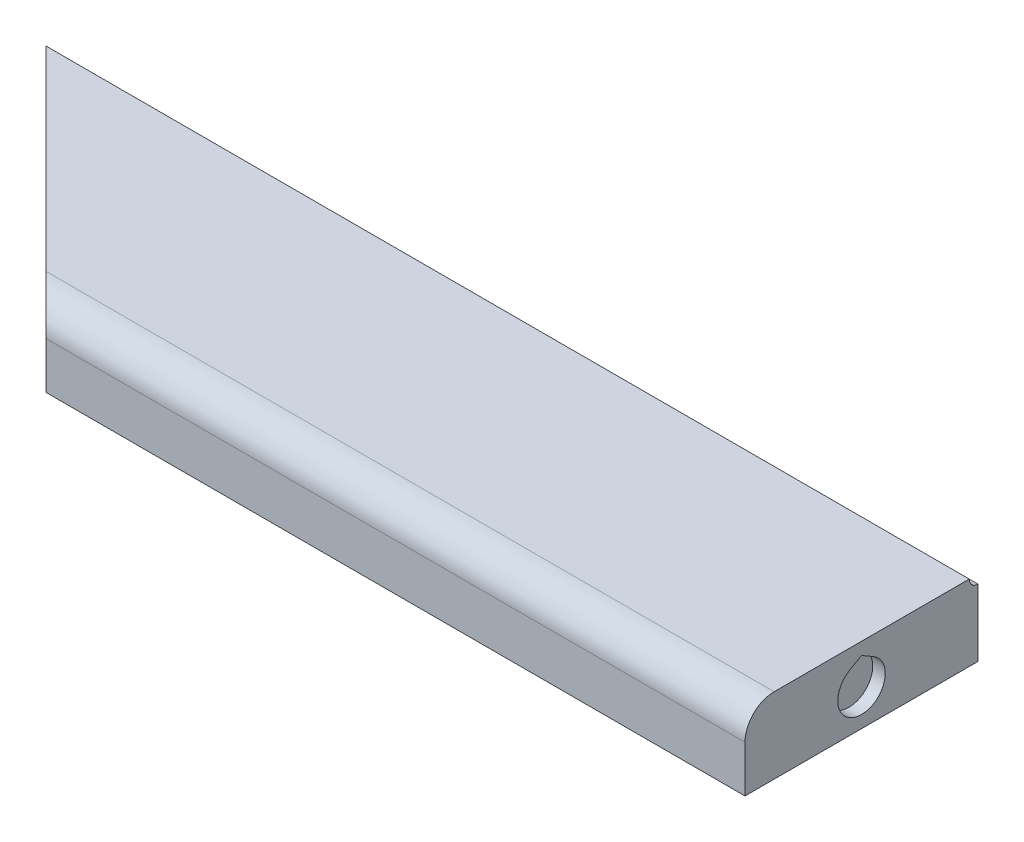
ISO-10303-21;
HEADER;
FILE_DESCRIPTION(('STEP AP214'),'2;1');
FILE_NAME('part.step','',(''),(''),'','','');
FILE_SCHEMA(('AUTOMOTIVE_DESIGN { 1 0 10303 214 1 1 1 1 }'));
ENDSEC;
DATA;
#1=APPLICATION_CONTEXT('core data for automotive mechanical design processes');
#2=APPLICATION_PROTOCOL_DEFINITION('international standard','automotive_design',2000,#1);
#3=PRODUCT_CONTEXT('',#1,'mechanical');
#4=PRODUCT('Part','Part','',(#3));
#5=PRODUCT_RELATED_PRODUCT_CATEGORY('part','',(#4));
#6=PRODUCT_DEFINITION_FORMATION('','',#4);
#7=PRODUCT_DEFINITION_CONTEXT('part definition',#1,'design');
#8=PRODUCT_DEFINITION('design','',#6,#7);
#9=PRODUCT_DEFINITION_SHAPE('','',#8);
#10=(LENGTH_UNIT() NAMED_UNIT(*) SI_UNIT(.MILLI.,.METRE.));
#11=(NAMED_UNIT(*) PLANE_ANGLE_UNIT() SI_UNIT($,.RADIAN.));
#12=(NAMED_UNIT(*) SI_UNIT($,.STERADIAN.) SOLID_ANGLE_UNIT());
#13=UNCERTAINTY_MEASURE_WITH_UNIT(LENGTH_MEASURE(1.E-05),#10,'distance_accuracy_value','');
#14=(GEOMETRIC_REPRESENTATION_CONTEXT(3) GLOBAL_UNCERTAINTY_ASSIGNED_CONTEXT((#13)) GLOBAL_UNIT_ASSIGNED_CONTEXT((#10,
#11,#12)) REPRESENTATION_CONTEXT('',''));
#15=CARTESIAN_POINT('',(0.,0.,0.));
#16=DIRECTION('',(0.,0.,1.));
#17=DIRECTION('',(1.,0.,0.));
#18=AXIS2_PLACEMENT_3D('',#15,#16,#17);
#19=CARTESIAN_POINT('',(80.,-13.,20.));
#20=DIRECTION('',(1.,0.,0.));
#21=DIRECTION('',(0.,0.,-1.));
#22=AXIS2_PLACEMENT_3D('',#19,#20,#21);
#23=PLANE('',#22);
#24=DIRECTION('',(0.,0.,-1.));
#25=VECTOR('',#24,1.);
#26=CARTESIAN_POINT('',(80.,0.,20.));
#27=LINE('',#26,#25);
#28=CARTESIAN_POINT('',(80.,0.,15.));
#29=VERTEX_POINT('',#28);
#30=CARTESIAN_POINT('',(80.,0.,-18.5));
#31=VERTEX_POINT('',#30);
#32=EDGE_CURVE('E270',#29,#31,#27,.T.);
#33=ORIENTED_EDGE('',*,*,#32,.F.);
#34=CARTESIAN_POINT('',(80.,-5.,15.));
#35=DIRECTION('',(1.,0.,0.));
#36=DIRECTION('',(0.,0.,-1.));
#37=AXIS2_PLACEMENT_3D('',#34,#35,#36);
#38=CIRCLE('',#37,5.);
#39=CARTESIAN_POINT('',(80.,-5.,20.));
#40=VERTEX_POINT('',#39);
#41=EDGE_CURVE('E300',#29,#40,#38,.T.);
#42=ORIENTED_EDGE('',*,*,#41,.T.);
#43=DIRECTION('',(0.,1.,0.));
#44=VECTOR('',#43,1.);
#45=CARTESIAN_POINT('',(80.,-13.,20.));
#46=LINE('',#45,#44);
#47=CARTESIAN_POINT('',(80.,-13.,20.));
#48=VERTEX_POINT('',#47);
#49=EDGE_CURVE('E290',#48,#40,#46,.T.);
#50=ORIENTED_EDGE('',*,*,#49,.F.);
#51=DIRECTION('',(0.,0.,-1.));
#52=VECTOR('',#51,1.);
#53=CARTESIAN_POINT('',(80.,-13.,20.));
#54=LINE('',#53,#52);
#55=CARTESIAN_POINT('',(80.,-13.,-20.));
#56=VERTEX_POINT('',#55);
#57=EDGE_CURVE('E273',#48,#56,#54,.T.);
#58=ORIENTED_EDGE('',*,*,#57,.T.);
#59=DIRECTION('',(0.,1.,0.));
#60=VECTOR('',#59,1.);
#61=CARTESIAN_POINT('',(80.,-13.,-20.));
#62=LINE('',#61,#60);
#63=CARTESIAN_POINT('',(80.,-1.5,-20.));
#64=VERTEX_POINT('',#63);
#65=EDGE_CURVE('E287',#56,#64,#62,.T.);
#66=ORIENTED_EDGE('',*,*,#65,.T.);
#67=CARTESIAN_POINT('',(80.,0.,-20.));
#68=DIRECTION('',(1.,0.,0.));
#69=DIRECTION('',(0.,0.,-1.));
#70=AXIS2_PLACEMENT_3D('',#67,#68,#69);
#71=CIRCLE('',#70,1.5);
#72=EDGE_CURVE('E231',#64,#31,#71,.F.);
#73=ORIENTED_EDGE('',*,*,#72,.T.);
#74=EDGE_LOOP('',(#33,#42,#50,#58,#66,#73));
#75=FACE_BOUND('',#74,.T.);
#76=DIRECTION('',(0.,-0.499999999999997,-0.866025403784441));
#77=VECTOR('',#76,1.);
#78=CARTESIAN_POINT('',(80.,-1.58234823978922,0.913569182193995));
#79=LINE('',#78,#77);
#80=CARTESIAN_POINT('',(80.,-2.10979765305228,0.));
#81=VERTEX_POINT('',#80);
#82=CARTESIAN_POINT('',(80.,-3.28614882652613,-2.03750000000002));
#83=VERTEX_POINT('',#82);
#84=EDGE_CURVE('E201',#81,#83,#79,.T.);
#85=ORIENTED_EDGE('',*,*,#84,.T.);
#86=CARTESIAN_POINT('',(80.,-6.81520234694772,0.));
#87=DIRECTION('',(1.,0.,0.));
#88=DIRECTION('',(0.,0.,-1.));
#89=AXIS2_PLACEMENT_3D('',#86,#87,#88);
#90=CIRCLE('',#89,4.075);
#91=CARTESIAN_POINT('',(80.,-3.28614882652612,2.03749999999996));
#92=VERTEX_POINT('',#91);
#93=EDGE_CURVE('E60',#83,#92,#90,.F.);
#94=ORIENTED_EDGE('',*,*,#93,.T.);
#95=DIRECTION('',(0.,-0.499999999999996,0.866025403784441));
#96=VECTOR('',#95,1.);
#97=CARTESIAN_POINT('',(80.,-1.58234823978922,-0.913569182194059));
#98=LINE('',#97,#96);
#99=EDGE_CURVE('E194',#81,#92,#98,.T.);
#100=ORIENTED_EDGE('',*,*,#99,.F.);
#101=EDGE_LOOP('',(#85,#94,#100));
#102=FACE_BOUND('',#101,.T.);
#103=ADVANCED_FACE('F37',(#75,#102),#23,.T.);
#104=CARTESIAN_POINT('',(-80.,-13.,-20.));
#105=DIRECTION('',(0.,0.,-1.));
#106=DIRECTION('',(-1.,0.,0.));
#107=AXIS2_PLACEMENT_3D('',#104,#105,#106);
#108=PLANE('',#107);
#109=CARTESIAN_POINT('',(40.,-7.56520234694772,-20.));
#110=DIRECTION('',(0.,0.,-1.));
#111=DIRECTION('',(-1.,0.,0.));
#112=AXIS2_PLACEMENT_3D('',#109,#110,#111);
#113=CIRCLE('',#112,4.075);
#114=CARTESIAN_POINT('',(42.0375,-4.03614882652612,-20.));
#115=VERTEX_POINT('',#114);
#116=CARTESIAN_POINT('',(37.9625,-4.03614882652615,-20.));
#117=VERTEX_POINT('',#116);
#118=EDGE_CURVE('E221',#115,#117,#113,.T.);
#119=ORIENTED_EDGE('',*,*,#118,.F.);
#120=DIRECTION('',(-0.866025403784441,0.499999999999996,0.));
#121=VECTOR('',#120,1.);
#122=CARTESIAN_POINT('',(8.76167129138664,15.1756598358994,-20.));
#123=LINE('',#122,#121);
#124=CARTESIAN_POINT('',(40.,-2.85979765305228,-20.));
#125=VERTEX_POINT('',#124);
#126=EDGE_CURVE('E216',#115,#125,#123,.T.);
#127=ORIENTED_EDGE('',*,*,#126,.T.);
#128=DIRECTION('',(-0.866025403784441,-0.499999999999996,0.));
#129=VECTOR('',#128,1.);
#130=CARTESIAN_POINT('',(11.238328708613,-19.4653563154779,-20.));
#131=LINE('',#130,#129);
#132=EDGE_CURVE('E223',#125,#117,#131,.T.);
#133=ORIENTED_EDGE('',*,*,#132,.T.);
#134=EDGE_LOOP('',(#119,#127,#133));
#135=FACE_BOUND('',#134,.T.);
#136=DIRECTION('',(-1.,0.,0.));
#137=VECTOR('',#136,1.);
#138=CARTESIAN_POINT('',(83.9999999999999,-1.5,-20.));
#139=LINE('',#138,#137);
#140=CARTESIAN_POINT('',(-80.,-1.5,-20.));
#141=VERTEX_POINT('',#140);
#142=EDGE_CURVE('E263',#64,#141,#139,.T.);
#143=ORIENTED_EDGE('',*,*,#142,.F.);
#144=ORIENTED_EDGE('',*,*,#65,.F.);
#145=DIRECTION('',(-1.,0.,0.));
#146=VECTOR('',#145,1.);
#147=CARTESIAN_POINT('',(-80.,-13.,-20.));
#148=LINE('',#147,#146);
#149=CARTESIAN_POINT('',(-80.,-13.,-20.));
#150=VERTEX_POINT('',#149);
#151=EDGE_CURVE('E276',#56,#150,#148,.T.);
#152=ORIENTED_EDGE('',*,*,#151,.T.);
#153=DIRECTION('',(0.,1.,0.));
#154=VECTOR('',#153,1.);
#155=CARTESIAN_POINT('',(-80.,-13.,-20.));
#156=LINE('',#155,#154);
#157=EDGE_CURVE('E283',#150,#141,#156,.T.);
#158=ORIENTED_EDGE('',*,*,#157,.T.);
#159=EDGE_LOOP('',(#143,#144,#152,#158));
#160=FACE_BOUND('',#159,.T.);
#161=DIRECTION('',(0.866025403784441,0.499999999999996,0.));
#162=VECTOR('',#161,1.);
#163=CARTESIAN_POINT('',(-8.76167129138664,15.1756598358995,-20.));
#164=LINE('',#163,#162);
#165=CARTESIAN_POINT('',(-42.0375,-4.03614882652612,-20.));
#166=VERTEX_POINT('',#165);
#167=CARTESIAN_POINT('',(-40.,-2.85979765305227,-20.));
#168=VERTEX_POINT('',#167);
#169=EDGE_CURVE('E248',#166,#168,#164,.T.);
#170=ORIENTED_EDGE('',*,*,#169,.F.);
#171=CARTESIAN_POINT('',(-40.,-7.56520234694772,-20.));
#172=DIRECTION('',(0.,0.,-1.));
#173=DIRECTION('',(-1.,0.,0.));
#174=AXIS2_PLACEMENT_3D('',#171,#172,#173);
#175=CIRCLE('',#174,4.075);
#176=CARTESIAN_POINT('',(-37.9625,-4.03614882652612,-20.));
#177=VERTEX_POINT('',#176);
#178=EDGE_CURVE('E208',#166,#177,#175,.F.);
#179=ORIENTED_EDGE('',*,*,#178,.T.);
#180=DIRECTION('',(0.866025403784441,-0.499999999999996,0.));
#181=VECTOR('',#180,1.);
#182=CARTESIAN_POINT('',(-11.238328708613,-19.4653563154779,-20.));
#183=LINE('',#182,#181);
#184=EDGE_CURVE('E239',#168,#177,#183,.T.);
#185=ORIENTED_EDGE('',*,*,#184,.F.);
#186=EDGE_LOOP('',(#170,#179,#185));
#187=FACE_BOUND('',#186,.T.);
#188=ADVANCED_FACE('F322',(#135,#160,#187),#108,.T.);
#189=CARTESIAN_POINT('',(-39.9999999999996,-13.,20.));
#190=DIRECTION('',(-0.707106781186544,0.,0.707106781186552));
#191=DIRECTION('',(0.707106781186551,0.,0.707106781186544));
#192=AXIS2_PLACEMENT_3D('',#189,#190,#191);
#193=PLANE('',#192);
#194=CARTESIAN_POINT('',(-59.9999999999998,-6.81520234694772,0.));
#195=DIRECTION('',(-0.707106781186544,0.,0.707106781186551));
#196=DIRECTION('',(0.707106781186551,0.,0.707106781186544));
#197=AXIS2_PLACEMENT_3D('',#194,#195,#196);
#198=CIRCLE('',#197,4.075);
#199=CARTESIAN_POINT('',(-61.4407300666674,-3.28614882652612,-1.44073006666754));
#200=VERTEX_POINT('',#199);
#201=CARTESIAN_POINT('',(-58.5592699333322,-3.28614882652614,1.4407300666676));
#202=VERTEX_POINT('',#201);
#203=EDGE_CURVE('E52',#200,#202,#198,.T.);
#204=ORIENTED_EDGE('',*,*,#203,.F.);
#205=DIRECTION('',(0.612372435695798,0.499999999999999,0.612372435695792));
#206=VECTOR('',#205,1.);
#207=CARTESIAN_POINT('',(-36.8540090361871,16.7888248310846,23.1459909638124));
#208=LINE('',#207,#206);
#209=CARTESIAN_POINT('',(-59.9999999999998,-2.10979765305228,0.));
#210=VERTEX_POINT('',#209);
#211=EDGE_CURVE('E179',#200,#210,#208,.T.);
#212=ORIENTED_EDGE('',*,*,#211,.T.);
#213=DIRECTION('',(0.612372435695799,-0.499999999999998,0.612372435695792));
#214=VECTOR('',#213,1.);
#215=CARTESIAN_POINT('',(-38.145990963812,-19.953521310663,21.8540090361876));
#216=LINE('',#215,#214);
#217=EDGE_CURVE('E182',#210,#202,#216,.T.);
#218=ORIENTED_EDGE('',*,*,#217,.T.);
#219=EDGE_LOOP('',(#204,#212,#218));
#220=FACE_BOUND('',#219,.T.);
#221=DIRECTION('',(0.,1.,0.));
#222=VECTOR('',#221,1.);
#223=CARTESIAN_POINT('',(-39.9999999999996,-13.,20.));
#224=LINE('',#223,#222);
#225=CARTESIAN_POINT('',(-39.9999999999996,-13.,20.));
#226=VERTEX_POINT('',#225);
#227=CARTESIAN_POINT('',(-39.9999999999996,-5.,20.));
#228=VERTEX_POINT('',#227);
#229=EDGE_CURVE('E279',#226,#228,#224,.T.);
#230=ORIENTED_EDGE('',*,*,#229,.T.);
#231=CARTESIAN_POINT('',(-44.9999999999996,-5.,15.));
#232=DIRECTION('',(-0.707106781186544,0.,0.707106781186552));
#233=DIRECTION('',(-0.707106781186551,0.,-0.707106781186544));
#234=AXIS2_PLACEMENT_3D('',#231,#232,#233);
#235=ELLIPSE('',#234,7.07106781186551,5.);
#236=CARTESIAN_POINT('',(-44.9999999999996,0.,15.));
#237=VERTEX_POINT('',#236);
#238=EDGE_CURVE('E11',#228,#237,#235,.T.);
#239=ORIENTED_EDGE('',*,*,#238,.T.);
#240=DIRECTION('',(0.707106781186551,0.,0.707106781186544));
#241=VECTOR('',#240,1.);
#242=CARTESIAN_POINT('',(-39.9999999999996,0.,20.));
#243=LINE('',#242,#241);
#244=CARTESIAN_POINT('',(-78.5,0.,-18.5));
#245=VERTEX_POINT('',#244);
#246=EDGE_CURVE('E265',#245,#237,#243,.T.);
#247=ORIENTED_EDGE('',*,*,#246,.F.);
#248=CARTESIAN_POINT('',(-80.,0.,-20.));
#249=DIRECTION('',(-0.707106781186544,0.,0.707106781186552));
#250=DIRECTION('',(-0.707106781186551,0.,-0.707106781186544));
#251=AXIS2_PLACEMENT_3D('',#248,#249,#250);
#252=ELLIPSE('',#251,2.12132034355966,1.5);
#253=EDGE_CURVE('E260',#245,#141,#252,.F.);
#254=ORIENTED_EDGE('',*,*,#253,.T.);
#255=ORIENTED_EDGE('',*,*,#157,.F.);
#256=DIRECTION('',(0.707106781186551,0.,0.707106781186544));
#257=VECTOR('',#256,1.);
#258=CARTESIAN_POINT('',(-39.9999999999996,-13.,20.));
#259=LINE('',#258,#257);
#260=EDGE_CURVE('E266',#150,#226,#259,.T.);
#261=ORIENTED_EDGE('',*,*,#260,.T.);
#262=EDGE_LOOP('',(#230,#239,#247,#254,#255,#261));
#263=FACE_BOUND('',#262,.T.);
#264=ADVANCED_FACE('F308',(#220,#263),#193,.T.);
#265=CARTESIAN_POINT('',(-39.9999999999996,-13.,20.));
#266=DIRECTION('',(0.,0.,1.));
#267=DIRECTION('',(1.,0.,0.));
#268=AXIS2_PLACEMENT_3D('',#265,#266,#267);
#269=PLANE('',#268);
#270=ORIENTED_EDGE('',*,*,#49,.T.);
#271=DIRECTION('',(1.,0.,0.));
#272=VECTOR('',#271,1.);
#273=CARTESIAN_POINT('',(-39.9999999999996,-5.,20.));
#274=LINE('',#273,#272);
#275=EDGE_CURVE('E45',#40,#228,#274,.F.);
#276=ORIENTED_EDGE('',*,*,#275,.T.);
#277=ORIENTED_EDGE('',*,*,#229,.F.);
#278=DIRECTION('',(1.,0.,0.));
#279=VECTOR('',#278,1.);
#280=CARTESIAN_POINT('',(-39.9999999999996,-13.,20.));
#281=LINE('',#280,#279);
#282=EDGE_CURVE('E269',#226,#48,#281,.T.);
#283=ORIENTED_EDGE('',*,*,#282,.T.);
#284=EDGE_LOOP('',(#270,#276,#277,#283));
#285=FACE_BOUND('',#284,.T.);
#286=ADVANCED_FACE('F303',(#285),#269,.T.);
#287=CARTESIAN_POINT('',(0.,-13.,0.));
#288=DIRECTION('',(0.,-1.,0.));
#289=DIRECTION('',(0.,0.,-1.));
#290=AXIS2_PLACEMENT_3D('',#287,#288,#289);
#291=PLANE('',#290);
#292=ORIENTED_EDGE('',*,*,#260,.F.);
#293=ORIENTED_EDGE('',*,*,#151,.F.);
#294=ORIENTED_EDGE('',*,*,#57,.F.);
#295=ORIENTED_EDGE('',*,*,#282,.F.);
#296=EDGE_LOOP('',(#292,#293,#294,#295));
#297=FACE_BOUND('',#296,.T.);
#298=ADVANCED_FACE('F326',(#297),#291,.T.);
#299=CARTESIAN_POINT('',(0.,0.,0.));
#300=DIRECTION('',(0.,-1.,0.));
#301=DIRECTION('',(0.,0.,-1.));
#302=AXIS2_PLACEMENT_3D('',#299,#300,#301);
#303=PLANE('',#302);
#304=ORIENTED_EDGE('',*,*,#246,.T.);
#305=DIRECTION('',(1.,0.,0.));
#306=VECTOR('',#305,1.);
#307=CARTESIAN_POINT('',(80.,0.,15.));
#308=LINE('',#307,#306);
#309=EDGE_CURVE('E297',#237,#29,#308,.T.);
#310=ORIENTED_EDGE('',*,*,#309,.T.);
#311=ORIENTED_EDGE('',*,*,#32,.T.);
#312=DIRECTION('',(-1.,0.,0.));
#313=VECTOR('',#312,1.);
#314=CARTESIAN_POINT('',(83.9999999999999,0.,-18.5));
#315=LINE('',#314,#313);
#316=EDGE_CURVE('E286',#31,#245,#315,.T.);
#317=ORIENTED_EDGE('',*,*,#316,.T.);
#318=EDGE_LOOP('',(#304,#310,#311,#317));
#319=FACE_BOUND('',#318,.T.);
#320=ADVANCED_FACE('F314',(#319),#303,.F.);
#321=CARTESIAN_POINT('',(83.9999999999999,0.,-20.));
#322=DIRECTION('',(-1.,0.,0.));
#323=DIRECTION('',(0.,0.,1.));
#324=AXIS2_PLACEMENT_3D('',#321,#322,#323);
#325=CYLINDRICAL_SURFACE('',#324,1.5);
#326=ORIENTED_EDGE('',*,*,#142,.T.);
#327=ORIENTED_EDGE('',*,*,#253,.F.);
#328=ORIENTED_EDGE('',*,*,#316,.F.);
#329=ORIENTED_EDGE('',*,*,#72,.F.);
#330=EDGE_LOOP('',(#326,#327,#328,#329));
#331=FACE_BOUND('',#330,.T.);
#332=ADVANCED_FACE('F320',(#331),#325,.F.);
#333=CARTESIAN_POINT('',(-40.,-7.56520234694772,-17.85));
#334=DIRECTION('',(0.,0.,-1.));
#335=DIRECTION('',(-1.,0.,0.));
#336=AXIS2_PLACEMENT_3D('',#333,#334,#335);
#337=CYLINDRICAL_SURFACE('',#336,4.075);
#338=ORIENTED_EDGE('',*,*,#178,.F.);
#339=DIRECTION('',(0.,0.,-1.));
#340=VECTOR('',#339,1.);
#341=CARTESIAN_POINT('',(-42.0375,-4.03614882652611,-17.85));
#342=LINE('',#341,#340);
#343=CARTESIAN_POINT('',(-42.0375,-4.03614882652611,-17.85));
#344=VERTEX_POINT('',#343);
#345=EDGE_CURVE('E245',#344,#166,#342,.T.);
#346=ORIENTED_EDGE('',*,*,#345,.F.);
#347=CARTESIAN_POINT('',(-40.,-7.56520234694772,-17.85));
#348=DIRECTION('',(0.,0.,-1.));
#349=DIRECTION('',(-1.,0.,0.));
#350=AXIS2_PLACEMENT_3D('',#347,#348,#349);
#351=CIRCLE('',#350,4.075);
#352=CARTESIAN_POINT('',(-37.9625,-4.03614882652612,-17.85));
#353=VERTEX_POINT('',#352);
#354=EDGE_CURVE('E236',#344,#353,#351,.F.);
#355=ORIENTED_EDGE('',*,*,#354,.T.);
#356=DIRECTION('',(0.,0.,-1.));
#357=VECTOR('',#356,1.);
#358=CARTESIAN_POINT('',(-37.9625,-4.03614882652612,-17.85));
#359=LINE('',#358,#357);
#360=EDGE_CURVE('E224',#353,#177,#359,.T.);
#361=ORIENTED_EDGE('',*,*,#360,.T.);
#362=EDGE_LOOP('',(#338,#346,#355,#361));
#363=FACE_BOUND('',#362,.T.);
#364=ADVANCED_FACE('F400',(#363),#337,.F.);
#365=CARTESIAN_POINT('',(-11.238328708613,-19.4653563154779,-17.85));
#366=DIRECTION('',(0.499999999999996,0.86602540378444,0.));
#367=DIRECTION('',(-0.866025403784441,0.499999999999997,0.));
#368=AXIS2_PLACEMENT_3D('',#365,#366,#367);
#369=PLANE('',#368);
#370=ORIENTED_EDGE('',*,*,#184,.T.);
#371=ORIENTED_EDGE('',*,*,#360,.F.);
#372=DIRECTION('',(0.866025403784441,-0.499999999999996,0.));
#373=VECTOR('',#372,1.);
#374=CARTESIAN_POINT('',(-11.238328708613,-19.4653563154779,-17.85));
#375=LINE('',#374,#373);
#376=CARTESIAN_POINT('',(-40.,-2.85979765305227,-17.85));
#377=VERTEX_POINT('',#376);
#378=EDGE_CURVE('E242',#377,#353,#375,.T.);
#379=ORIENTED_EDGE('',*,*,#378,.F.);
#380=DIRECTION('',(0.,0.,-1.));
#381=VECTOR('',#380,1.);
#382=CARTESIAN_POINT('',(-40.,-2.85979765305227,-17.85));
#383=LINE('',#382,#381);
#384=EDGE_CURVE('E254',#377,#168,#383,.T.);
#385=ORIENTED_EDGE('',*,*,#384,.T.);
#386=EDGE_LOOP('',(#370,#371,#379,#385));
#387=FACE_BOUND('',#386,.T.);
#388=ADVANCED_FACE('F397',(#387),#369,.F.);
#389=CARTESIAN_POINT('',(-8.76167129138664,15.1756598358995,-17.85));
#390=DIRECTION('',(-0.499999999999996,0.866025403784441,0.));
#391=DIRECTION('',(-0.866025403784441,-0.499999999999996,0.));
#392=AXIS2_PLACEMENT_3D('',#389,#390,#391);
#393=PLANE('',#392);
#394=ORIENTED_EDGE('',*,*,#169,.T.);
#395=ORIENTED_EDGE('',*,*,#384,.F.);
#396=DIRECTION('',(0.866025403784441,0.499999999999996,0.));
#397=VECTOR('',#396,1.);
#398=CARTESIAN_POINT('',(-8.76167129138664,15.1756598358995,-17.85));
#399=LINE('',#398,#397);
#400=EDGE_CURVE('E238',#344,#377,#399,.T.);
#401=ORIENTED_EDGE('',*,*,#400,.F.);
#402=ORIENTED_EDGE('',*,*,#345,.T.);
#403=EDGE_LOOP('',(#394,#395,#401,#402));
#404=FACE_BOUND('',#403,.T.);
#405=ADVANCED_FACE('F395',(#404),#393,.F.);
#406=CARTESIAN_POINT('',(0.,0.,-17.85));
#407=DIRECTION('',(0.,0.,-1.));
#408=DIRECTION('',(-1.,0.,0.));
#409=AXIS2_PLACEMENT_3D('',#406,#407,#408);
#410=PLANE('',#409);
#411=ORIENTED_EDGE('',*,*,#354,.F.);
#412=ORIENTED_EDGE('',*,*,#400,.T.);
#413=ORIENTED_EDGE('',*,*,#378,.T.);
#414=EDGE_LOOP('',(#411,#412,#413));
#415=FACE_BOUND('',#414,.T.);
#416=ADVANCED_FACE('F391',(#415),#410,.T.);
#417=CARTESIAN_POINT('',(40.,-7.56520234694772,-17.85));
#418=DIRECTION('',(0.,0.,-1.));
#419=DIRECTION('',(-1.,0.,0.));
#420=AXIS2_PLACEMENT_3D('',#417,#418,#419);
#421=CYLINDRICAL_SURFACE('',#420,4.075);
#422=ORIENTED_EDGE('',*,*,#118,.T.);
#423=DIRECTION('',(0.,0.,-1.));
#424=VECTOR('',#423,1.);
#425=CARTESIAN_POINT('',(37.9625,-4.03614882652613,-17.85));
#426=LINE('',#425,#424);
#427=CARTESIAN_POINT('',(37.9625,-4.03614882652613,-17.85));
#428=VERTEX_POINT('',#427);
#429=EDGE_CURVE('E220',#428,#117,#426,.T.);
#430=ORIENTED_EDGE('',*,*,#429,.F.);
#431=CARTESIAN_POINT('',(40.,-7.56520234694772,-17.85));
#432=DIRECTION('',(0.,0.,-1.));
#433=DIRECTION('',(-1.,0.,0.));
#434=AXIS2_PLACEMENT_3D('',#431,#432,#433);
#435=CIRCLE('',#434,4.075);
#436=CARTESIAN_POINT('',(42.0375,-4.03614882652612,-17.85));
#437=VERTEX_POINT('',#436);
#438=EDGE_CURVE('E212',#437,#428,#435,.T.);
#439=ORIENTED_EDGE('',*,*,#438,.F.);
#440=DIRECTION('',(0.,0.,-1.));
#441=VECTOR('',#440,1.);
#442=CARTESIAN_POINT('',(42.0375,-4.03614882652612,-17.85));
#443=LINE('',#442,#441);
#444=EDGE_CURVE('E229',#437,#115,#443,.T.);
#445=ORIENTED_EDGE('',*,*,#444,.T.);
#446=EDGE_LOOP('',(#422,#430,#439,#445));
#447=FACE_BOUND('',#446,.T.);
#448=ADVANCED_FACE('F384',(#447),#421,.F.);
#449=CARTESIAN_POINT('',(8.76167129138664,15.1756598358994,-17.85));
#450=DIRECTION('',(-0.499999999999996,-0.866025403784441,0.));
#451=DIRECTION('',(0.866025403784441,-0.499999999999996,0.));
#452=AXIS2_PLACEMENT_3D('',#449,#450,#451);
#453=PLANE('',#452);
#454=ORIENTED_EDGE('',*,*,#126,.F.);
#455=ORIENTED_EDGE('',*,*,#444,.F.);
#456=DIRECTION('',(-0.866025403784441,0.499999999999996,0.));
#457=VECTOR('',#456,1.);
#458=CARTESIAN_POINT('',(8.76167129138664,15.1756598358994,-17.85));
#459=LINE('',#458,#457);
#460=CARTESIAN_POINT('',(40.,-2.85979765305228,-17.85));
#461=VERTEX_POINT('',#460);
#462=EDGE_CURVE('E218',#437,#461,#459,.T.);
#463=ORIENTED_EDGE('',*,*,#462,.T.);
#464=DIRECTION('',(0.,0.,-1.));
#465=VECTOR('',#464,1.);
#466=CARTESIAN_POINT('',(40.,-2.85979765305228,-17.85));
#467=LINE('',#466,#465);
#468=EDGE_CURVE('E232',#461,#125,#467,.T.);
#469=ORIENTED_EDGE('',*,*,#468,.T.);
#470=EDGE_LOOP('',(#454,#455,#463,#469));
#471=FACE_BOUND('',#470,.T.);
#472=ADVANCED_FACE('F381',(#471),#453,.T.);
#473=CARTESIAN_POINT('',(11.238328708613,-19.4653563154779,-17.85));
#474=DIRECTION('',(0.499999999999996,-0.86602540378444,0.));
#475=DIRECTION('',(0.866025403784441,0.499999999999997,0.));
#476=AXIS2_PLACEMENT_3D('',#473,#474,#475);
#477=PLANE('',#476);
#478=ORIENTED_EDGE('',*,*,#132,.F.);
#479=ORIENTED_EDGE('',*,*,#468,.F.);
#480=DIRECTION('',(-0.866025403784441,-0.499999999999996,0.));
#481=VECTOR('',#480,1.);
#482=CARTESIAN_POINT('',(11.238328708613,-19.4653563154779,-17.85));
#483=LINE('',#482,#481);
#484=EDGE_CURVE('E215',#461,#428,#483,.T.);
#485=ORIENTED_EDGE('',*,*,#484,.T.);
#486=ORIENTED_EDGE('',*,*,#429,.T.);
#487=EDGE_LOOP('',(#478,#479,#485,#486));
#488=FACE_BOUND('',#487,.T.);
#489=ADVANCED_FACE('F379',(#488),#477,.T.);
#490=CARTESIAN_POINT('',(0.,0.,-17.85));
#491=DIRECTION('',(0.,0.,-1.));
#492=DIRECTION('',(-1.,0.,0.));
#493=AXIS2_PLACEMENT_3D('',#490,#491,#492);
#494=PLANE('',#493);
#495=ORIENTED_EDGE('',*,*,#438,.T.);
#496=ORIENTED_EDGE('',*,*,#484,.F.);
#497=ORIENTED_EDGE('',*,*,#462,.F.);
#498=EDGE_LOOP('',(#495,#496,#497));
#499=FACE_BOUND('',#498,.T.);
#500=ADVANCED_FACE('F376',(#499),#494,.T.);
#501=CARTESIAN_POINT('',(0.,-5.,15.));
#502=DIRECTION('',(-1.,0.,0.));
#503=DIRECTION('',(0.,0.,1.));
#504=AXIS2_PLACEMENT_3D('',#501,#502,#503);
#505=CYLINDRICAL_SURFACE('',#504,5.);
#506=ORIENTED_EDGE('',*,*,#238,.F.);
#507=ORIENTED_EDGE('',*,*,#275,.F.);
#508=ORIENTED_EDGE('',*,*,#41,.F.);
#509=ORIENTED_EDGE('',*,*,#309,.F.);
#510=EDGE_LOOP('',(#506,#507,#508,#509));
#511=FACE_BOUND('',#510,.T.);
#512=ADVANCED_FACE('F39',(#511),#505,.T.);
#513=CARTESIAN_POINT('',(77.85,-6.81520234694772,0.));
#514=DIRECTION('',(1.,0.,0.));
#515=DIRECTION('',(0.,0.,-1.));
#516=AXIS2_PLACEMENT_3D('',#513,#514,#515);
#517=CYLINDRICAL_SURFACE('',#516,4.075);
#518=ORIENTED_EDGE('',*,*,#93,.F.);
#519=DIRECTION('',(1.,0.,0.));
#520=VECTOR('',#519,1.);
#521=CARTESIAN_POINT('',(77.85,-3.28614882652613,-2.03750000000002));
#522=LINE('',#521,#520);
#523=CARTESIAN_POINT('',(77.85,-3.28614882652613,-2.03750000000002));
#524=VERTEX_POINT('',#523);
#525=EDGE_CURVE('E199',#524,#83,#522,.T.);
#526=ORIENTED_EDGE('',*,*,#525,.F.);
#527=CARTESIAN_POINT('',(77.85,-6.81520234694772,0.));
#528=DIRECTION('',(1.,0.,0.));
#529=DIRECTION('',(0.,0.,-1.));
#530=AXIS2_PLACEMENT_3D('',#527,#528,#529);
#531=CIRCLE('',#530,4.075);
#532=CARTESIAN_POINT('',(77.85,-3.28614882652612,2.03749999999996));
#533=VERTEX_POINT('',#532);
#534=EDGE_CURVE('E191',#524,#533,#531,.F.);
#535=ORIENTED_EDGE('',*,*,#534,.T.);
#536=DIRECTION('',(1.,0.,0.));
#537=VECTOR('',#536,1.);
#538=CARTESIAN_POINT('',(77.85,-3.28614882652612,2.03749999999996));
#539=LINE('',#538,#537);
#540=EDGE_CURVE('E206',#533,#92,#539,.T.);
#541=ORIENTED_EDGE('',*,*,#540,.T.);
#542=EDGE_LOOP('',(#518,#526,#535,#541));
#543=FACE_BOUND('',#542,.T.);
#544=ADVANCED_FACE('F369',(#543),#517,.F.);
#545=CARTESIAN_POINT('',(77.85,-1.58234823978922,-0.913569182194059));
#546=DIRECTION('',(0.,0.866025403784441,0.499999999999996));
#547=DIRECTION('',(0.,-0.499999999999996,0.866025403784441));
#548=AXIS2_PLACEMENT_3D('',#545,#546,#547);
#549=PLANE('',#548);
#550=ORIENTED_EDGE('',*,*,#99,.T.);
#551=ORIENTED_EDGE('',*,*,#540,.F.);
#552=DIRECTION('',(0.,-0.499999999999996,0.866025403784441));
#553=VECTOR('',#552,1.);
#554=CARTESIAN_POINT('',(77.85,-1.58234823978922,-0.913569182194059));
#555=LINE('',#554,#553);
#556=CARTESIAN_POINT('',(77.85,-2.10979765305228,0.));
#557=VERTEX_POINT('',#556);
#558=EDGE_CURVE('E196',#557,#533,#555,.T.);
#559=ORIENTED_EDGE('',*,*,#558,.F.);
#560=DIRECTION('',(1.,0.,0.));
#561=VECTOR('',#560,1.);
#562=CARTESIAN_POINT('',(77.85,-2.10979765305228,0.));
#563=LINE('',#562,#561);
#564=EDGE_CURVE('E209',#557,#81,#563,.T.);
#565=ORIENTED_EDGE('',*,*,#564,.T.);
#566=EDGE_LOOP('',(#550,#551,#559,#565));
#567=FACE_BOUND('',#566,.T.);
#568=ADVANCED_FACE('F366',(#567),#549,.F.);
#569=CARTESIAN_POINT('',(77.85,-1.58234823978922,0.913569182193995));
#570=DIRECTION('',(0.,-0.86602540378444,0.499999999999997));
#571=DIRECTION('',(0.,-0.499999999999997,-0.86602540378444));
#572=AXIS2_PLACEMENT_3D('',#569,#570,#571);
#573=PLANE('',#572);
#574=ORIENTED_EDGE('',*,*,#84,.F.);
#575=ORIENTED_EDGE('',*,*,#564,.F.);
#576=DIRECTION('',(0.,-0.499999999999997,-0.866025403784441));
#577=VECTOR('',#576,1.);
#578=CARTESIAN_POINT('',(77.85,-1.58234823978922,0.913569182193995));
#579=LINE('',#578,#577);
#580=EDGE_CURVE('E193',#557,#524,#579,.T.);
#581=ORIENTED_EDGE('',*,*,#580,.T.);
#582=ORIENTED_EDGE('',*,*,#525,.T.);
#583=EDGE_LOOP('',(#574,#575,#581,#582));
#584=FACE_BOUND('',#583,.T.);
#585=ADVANCED_FACE('F364',(#584),#573,.T.);
#586=CARTESIAN_POINT('',(77.85,0.,0.));
#587=DIRECTION('',(1.,0.,0.));
#588=DIRECTION('',(0.,0.,-1.));
#589=AXIS2_PLACEMENT_3D('',#586,#587,#588);
#590=PLANE('',#589);
#591=ORIENTED_EDGE('',*,*,#534,.F.);
#592=ORIENTED_EDGE('',*,*,#580,.F.);
#593=ORIENTED_EDGE('',*,*,#558,.T.);
#594=EDGE_LOOP('',(#591,#592,#593));
#595=FACE_BOUND('',#594,.T.);
#596=ADVANCED_FACE('F358',(#595),#590,.T.);
#597=CARTESIAN_POINT('',(-58.4797204204487,-6.81520234694772,-1.52027957955105));
#598=DIRECTION('',(-0.707106781186543,0.,0.707106781186551));
#599=DIRECTION('',(0.707106781186551,0.,0.707106781186544));
#600=AXIS2_PLACEMENT_3D('',#597,#598,#599);
#601=CYLINDRICAL_SURFACE('',#600,4.075);
#602=ORIENTED_EDGE('',*,*,#203,.T.);
#603=DIRECTION('',(-0.707106781186543,0.,0.707106781186551));
#604=VECTOR('',#603,1.);
#605=CARTESIAN_POINT('',(-57.0389903537811,-3.28614882652613,-0.0795495128834793));
#606=LINE('',#605,#604);
#607=CARTESIAN_POINT('',(-57.0389903537811,-3.28614882652613,-0.0795495128834793));
#608=VERTEX_POINT('',#607);
#609=EDGE_CURVE('E166',#608,#202,#606,.T.);
#610=ORIENTED_EDGE('',*,*,#609,.F.);
#611=CARTESIAN_POINT('',(-58.4797204204487,-6.81520234694772,-1.52027957955105));
#612=DIRECTION('',(-0.707106781186544,0.,0.707106781186551));
#613=DIRECTION('',(0.707106781186551,0.,0.707106781186544));
#614=AXIS2_PLACEMENT_3D('',#611,#612,#613);
#615=CIRCLE('',#614,4.075);
#616=CARTESIAN_POINT('',(-59.9204504871163,-3.28614882652612,-2.96100964621862));
#617=VERTEX_POINT('',#616);
#618=EDGE_CURVE('E173',#617,#608,#615,.T.);
#619=ORIENTED_EDGE('',*,*,#618,.F.);
#620=DIRECTION('',(-0.707106781186543,0.,0.707106781186551));
#621=VECTOR('',#620,1.);
#622=CARTESIAN_POINT('',(-59.9204504871163,-3.28614882652612,-2.96100964621862));
#623=LINE('',#622,#621);
#624=EDGE_CURVE('E188',#617,#200,#623,.T.);
#625=ORIENTED_EDGE('',*,*,#624,.T.);
#626=EDGE_LOOP('',(#602,#610,#619,#625));
#627=FACE_BOUND('',#626,.T.);
#628=ADVANCED_FACE('F176',(#627),#601,.F.);
#629=CARTESIAN_POINT('',(-35.3337294566361,16.7888248310846,21.6257113842613));
#630=DIRECTION('',(0.353553390593275,-0.866025403784439,0.353553390593271));
#631=DIRECTION('',(0.925820099772551,0.377964473009228,0.));
#632=AXIS2_PLACEMENT_3D('',#629,#630,#631);
#633=PLANE('',#632);
#634=ORIENTED_EDGE('',*,*,#211,.F.);
#635=ORIENTED_EDGE('',*,*,#624,.F.);
#636=DIRECTION('',(0.612372435695798,0.499999999999999,0.612372435695792));
#637=VECTOR('',#636,1.);
#638=CARTESIAN_POINT('',(-35.3337294566361,16.7888248310846,21.6257113842613));
#639=LINE('',#638,#637);
#640=CARTESIAN_POINT('',(-58.4797204204487,-2.10979765305228,-1.52027957955105));
#641=VERTEX_POINT('',#640);
#642=EDGE_CURVE('E172',#617,#641,#639,.T.);
#643=ORIENTED_EDGE('',*,*,#642,.T.);
#644=DIRECTION('',(-0.707106781186543,0.,0.707106781186551));
#645=VECTOR('',#644,1.);
#646=CARTESIAN_POINT('',(-58.4797204204487,-2.10979765305228,-1.52027957955105));
#647=LINE('',#646,#645);
#648=EDGE_CURVE('E168',#641,#210,#647,.T.);
#649=ORIENTED_EDGE('',*,*,#648,.T.);
#650=EDGE_LOOP('',(#634,#635,#643,#649));
#651=FACE_BOUND('',#650,.T.);
#652=ADVANCED_FACE('F350',(#651),#633,.T.);
#653=CARTESIAN_POINT('',(-36.625711384261,-19.953521310663,20.3337294566365));
#654=DIRECTION('',(-0.353553390593274,-0.86602540378444,-0.35355339059327));
#655=DIRECTION('',(0.925820099772552,-0.377964473009227,0.));
#656=AXIS2_PLACEMENT_3D('',#653,#654,#655);
#657=PLANE('',#656);
#658=ORIENTED_EDGE('',*,*,#217,.F.);
#659=ORIENTED_EDGE('',*,*,#648,.F.);
#660=DIRECTION('',(0.612372435695799,-0.499999999999998,0.612372435695792));
#661=VECTOR('',#660,1.);
#662=CARTESIAN_POINT('',(-36.625711384261,-19.953521310663,20.3337294566365));
#663=LINE('',#662,#661);
#664=EDGE_CURVE('E163',#641,#608,#663,.T.);
#665=ORIENTED_EDGE('',*,*,#664,.T.);
#666=ORIENTED_EDGE('',*,*,#609,.T.);
#667=EDGE_LOOP('',(#658,#659,#665,#666));
#668=FACE_BOUND('',#667,.T.);
#669=ADVANCED_FACE('F165',(#668),#657,.T.);
#670=CARTESIAN_POINT('',(-28.4797204204485,0.,28.4797204204488));
#671=DIRECTION('',(-0.707106781186544,0.,0.707106781186551));
#672=DIRECTION('',(0.707106781186551,0.,0.707106781186544));
#673=AXIS2_PLACEMENT_3D('',#670,#671,#672);
#674=PLANE('',#673);
#675=ORIENTED_EDGE('',*,*,#618,.T.);
#676=ORIENTED_EDGE('',*,*,#664,.F.);
#677=ORIENTED_EDGE('',*,*,#642,.F.);
#678=EDGE_LOOP('',(#675,#676,#677));
#679=FACE_BOUND('',#678,.T.);
#680=ADVANCED_FACE('F178',(#679),#674,.T.);
#681=CLOSED_SHELL('',(#103,#188,#264,#286,#298,#320,#332,#364,#388,#405,#416,#448,#472,#489,
#500,#512,#544,#568,#585,#596,#628,#652,#669,#680));
#682=MANIFOLD_SOLID_BREP('B2',#681);
#683=ADVANCED_BREP_SHAPE_REPRESENTATION('',(#18,#682),#14);
#684=SHAPE_DEFINITION_REPRESENTATION(#9,#683);
ENDSEC;
END-ISO-10303-21;
